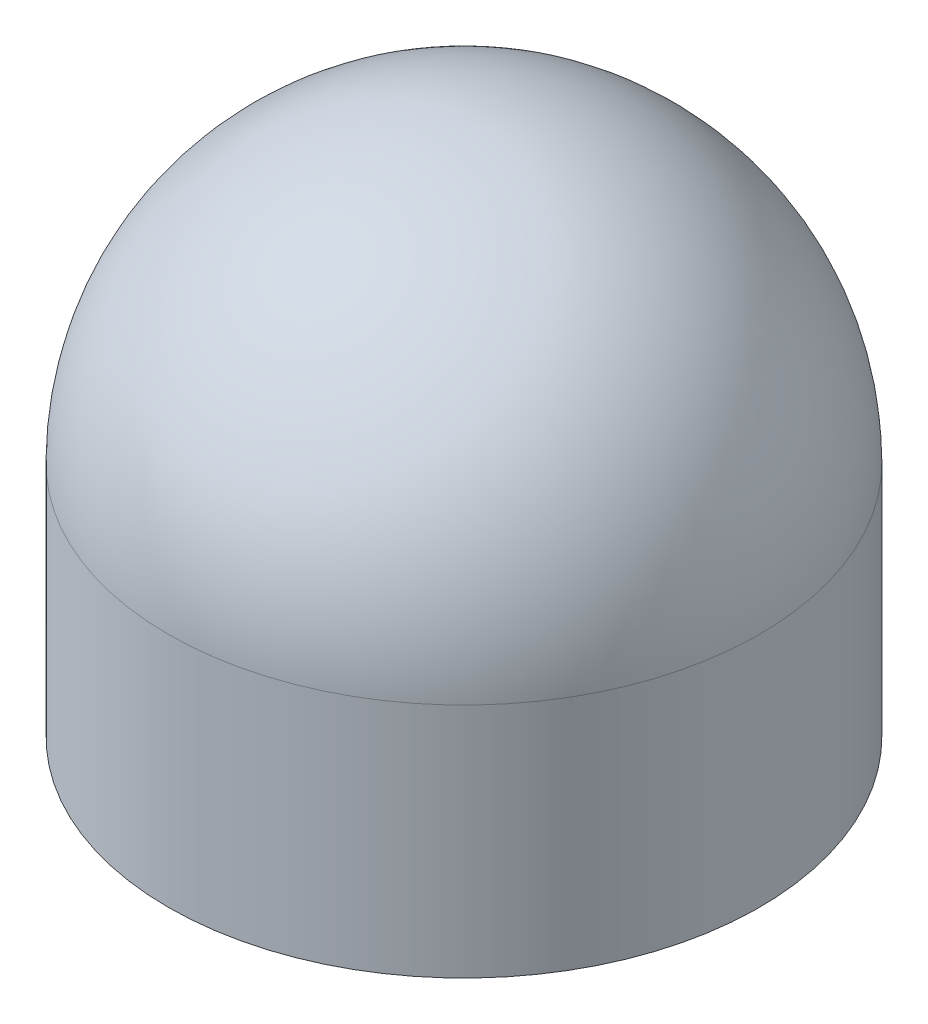
ISO-10303-21;
HEADER;
FILE_DESCRIPTION(('STEP AP214'),'2;1');
FILE_NAME('part.step','',(''),(''),'','','');
FILE_SCHEMA(('AUTOMOTIVE_DESIGN { 1 0 10303 214 1 1 1 1 }'));
ENDSEC;
DATA;
#1=APPLICATION_CONTEXT('core data for automotive mechanical design processes');
#2=APPLICATION_PROTOCOL_DEFINITION('international standard','automotive_design',2000,#1);
#3=PRODUCT_CONTEXT('',#1,'mechanical');
#4=PRODUCT('Part','Part','',(#3));
#5=PRODUCT_RELATED_PRODUCT_CATEGORY('part','',(#4));
#6=PRODUCT_DEFINITION_FORMATION('','',#4);
#7=PRODUCT_DEFINITION_CONTEXT('part definition',#1,'design');
#8=PRODUCT_DEFINITION('design','',#6,#7);
#9=PRODUCT_DEFINITION_SHAPE('','',#8);
#10=(LENGTH_UNIT() NAMED_UNIT(*) SI_UNIT(.MILLI.,.METRE.));
#11=(NAMED_UNIT(*) PLANE_ANGLE_UNIT() SI_UNIT($,.RADIAN.));
#12=(NAMED_UNIT(*) SI_UNIT($,.STERADIAN.) SOLID_ANGLE_UNIT());
#13=UNCERTAINTY_MEASURE_WITH_UNIT(LENGTH_MEASURE(1.E-05),#10,'distance_accuracy_value','');
#14=(GEOMETRIC_REPRESENTATION_CONTEXT(3) GLOBAL_UNCERTAINTY_ASSIGNED_CONTEXT((#13)) GLOBAL_UNIT_ASSIGNED_CONTEXT((#10,
#11,#12)) REPRESENTATION_CONTEXT('',''));
#15=CARTESIAN_POINT('',(0.,0.,0.));
#16=DIRECTION('',(0.,0.,1.));
#17=DIRECTION('',(1.,0.,0.));
#18=AXIS2_PLACEMENT_3D('',#15,#16,#17);
#19=CARTESIAN_POINT('',(0.,20.,0.));
#20=DIRECTION('',(0.,-1.,0.));
#21=DIRECTION('',(0.,0.,-1.));
#22=AXIS2_PLACEMENT_3D('',#19,#20,#21);
#23=CYLINDRICAL_SURFACE('',#22,25.);
#24=CARTESIAN_POINT('',(0.,20.,0.));
#25=DIRECTION('',(0.,1.,0.));
#26=DIRECTION('',(0.,0.,1.));
#27=AXIS2_PLACEMENT_3D('',#24,#25,#26);
#28=CIRCLE('',#27,25.);
#29=CARTESIAN_POINT('',(0.,20.,25.));
#30=VERTEX_POINT('',#29);
#31=EDGE_CURVE('E37',#30,#30,#28,.T.);
#32=ORIENTED_EDGE('',*,*,#31,.F.);
#33=EDGE_LOOP('',(#32));
#34=FACE_BOUND('',#33,.T.);
#35=CARTESIAN_POINT('',(0.,0.,0.));
#36=DIRECTION('',(0.,1.,0.));
#37=DIRECTION('',(0.,0.,1.));
#38=AXIS2_PLACEMENT_3D('',#35,#36,#37);
#39=CIRCLE('',#38,25.);
#40=CARTESIAN_POINT('',(0.,0.,25.));
#41=VERTEX_POINT('',#40);
#42=EDGE_CURVE('E41',#41,#41,#39,.T.);
#43=ORIENTED_EDGE('',*,*,#42,.T.);
#44=EDGE_LOOP('',(#43));
#45=FACE_BOUND('',#44,.T.);
#46=ADVANCED_FACE('F31',(#34,#45),#23,.T.);
#47=CARTESIAN_POINT('',(0.,0.,0.));
#48=DIRECTION('',(0.,1.,0.));
#49=DIRECTION('',(0.,0.,1.));
#50=AXIS2_PLACEMENT_3D('',#47,#48,#49);
#51=PLANE('',#50);
#52=CARTESIAN_POINT('',(0.,0.,0.));
#53=DIRECTION('',(0.,1.,0.));
#54=DIRECTION('',(0.,0.,1.));
#55=AXIS2_PLACEMENT_3D('',#52,#53,#54);
#56=CIRCLE('',#55,15.);
#57=CARTESIAN_POINT('',(0.,0.,15.));
#58=VERTEX_POINT('',#57);
#59=EDGE_CURVE('E10',#58,#58,#56,.F.);
#60=ORIENTED_EDGE('',*,*,#59,.F.);
#61=EDGE_LOOP('',(#60));
#62=FACE_BOUND('',#61,.T.);
#63=ORIENTED_EDGE('',*,*,#42,.F.);
#64=EDGE_LOOP('',(#63));
#65=FACE_BOUND('',#64,.T.);
#66=ADVANCED_FACE('F49',(#62,#65),#51,.F.);
#67=CARTESIAN_POINT('',(0.,20.,0.));
#68=DIRECTION('',(0.,0.,-1.));
#69=DIRECTION('',(1.,0.,0.));
#70=AXIS2_PLACEMENT_3D('',#67,#68,#69);
#71=SPHERICAL_SURFACE('',#70,25.);
#72=CARTESIAN_POINT('',(0.,20.,0.));
#73=DIRECTION('',(0.,1.,0.));
#74=DIRECTION('',(0.,0.,1.));
#75=AXIS2_PLACEMENT_3D('',#72,#73,#74);
#76=SPHERICAL_SURFACE('',#75,25.);
#77=ORIENTED_EDGE('',*,*,#59,.T.);
#78=EDGE_LOOP('',(#77));
#79=FACE_BOUND('',#78,.T.);
#80=ADVANCED_FACE('F51',(#79),#76,.T.);
#81=CARTESIAN_POINT('',(0.,20.,0.));
#82=DIRECTION('',(0.,1.,0.));
#83=DIRECTION('',(0.,0.,1.));
#84=AXIS2_PLACEMENT_3D('',#81,#82,#83);
#85=SPHERICAL_SURFACE('',#84,25.);
#86=ORIENTED_EDGE('',*,*,#31,.T.);
#87=EDGE_LOOP('',(#86));
#88=FACE_BOUND('',#87,.T.);
#89=ADVANCED_FACE('F57',(#88),#85,.T.);
#90=CLOSED_SHELL('',(#46,#66,#80,#89));
#91=MANIFOLD_SOLID_BREP('B2',#90);
#92=ADVANCED_BREP_SHAPE_REPRESENTATION('',(#18,#91),#14);
#93=SHAPE_DEFINITION_REPRESENTATION(#9,#92);
ENDSEC;
END-ISO-10303-21;
